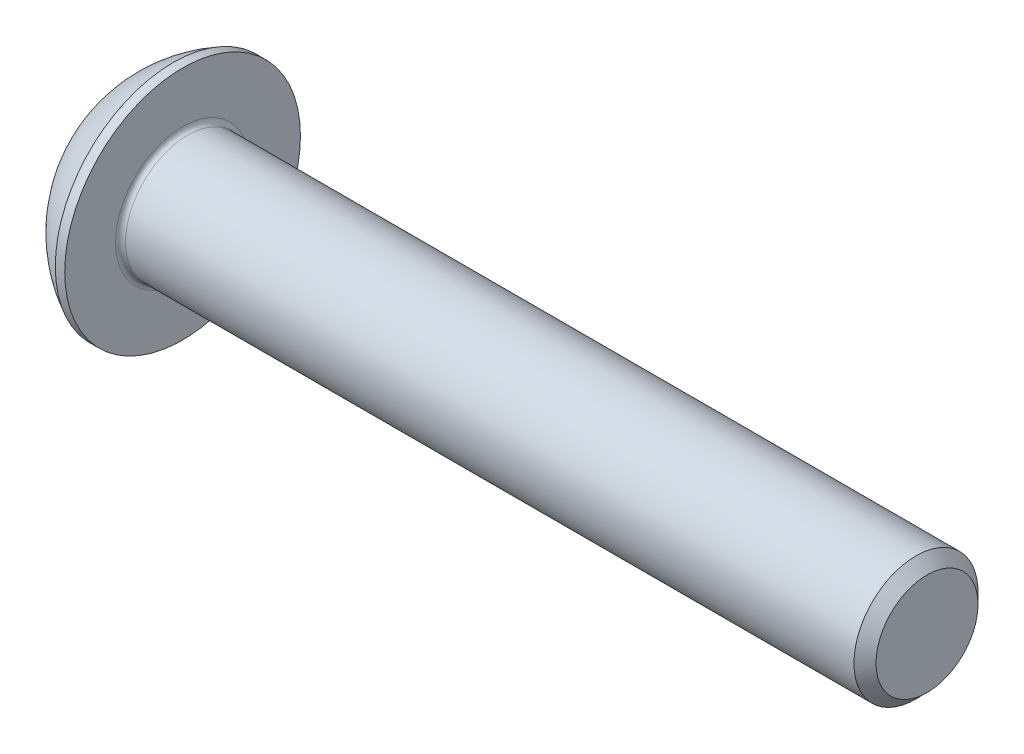
ISO-10303-21;
HEADER;
FILE_DESCRIPTION(('STEP AP214'),'2;1');
FILE_NAME('part.step','',(''),(''),'','','');
FILE_SCHEMA(('AUTOMOTIVE_DESIGN { 1 0 10303 214 1 1 1 1 }'));
ENDSEC;
DATA;
#1=APPLICATION_CONTEXT('core data for automotive mechanical design processes');
#2=APPLICATION_PROTOCOL_DEFINITION('international standard','automotive_design',2000,#1);
#3=PRODUCT_CONTEXT('',#1,'mechanical');
#4=PRODUCT('Part','Part','',(#3));
#5=PRODUCT_RELATED_PRODUCT_CATEGORY('part','',(#4));
#6=PRODUCT_DEFINITION_FORMATION('','',#4);
#7=PRODUCT_DEFINITION_CONTEXT('part definition',#1,'design');
#8=PRODUCT_DEFINITION('design','',#6,#7);
#9=PRODUCT_DEFINITION_SHAPE('','',#8);
#10=(LENGTH_UNIT() NAMED_UNIT(*) SI_UNIT(.MILLI.,.METRE.));
#11=(NAMED_UNIT(*) PLANE_ANGLE_UNIT() SI_UNIT($,.RADIAN.));
#12=(NAMED_UNIT(*) SI_UNIT($,.STERADIAN.) SOLID_ANGLE_UNIT());
#13=UNCERTAINTY_MEASURE_WITH_UNIT(LENGTH_MEASURE(1.E-05),#10,'distance_accuracy_value','');
#14=(GEOMETRIC_REPRESENTATION_CONTEXT(3) GLOBAL_UNCERTAINTY_ASSIGNED_CONTEXT((#13)) GLOBAL_UNIT_ASSIGNED_CONTEXT((#10,
#11,#12)) REPRESENTATION_CONTEXT('',''));
#15=CARTESIAN_POINT('',(0.,0.,0.));
#16=DIRECTION('',(0.,0.,1.));
#17=DIRECTION('',(1.,0.,0.));
#18=AXIS2_PLACEMENT_3D('',#15,#16,#17);
#19=CARTESIAN_POINT('',(0.,0.,0.));
#20=DIRECTION('',(-1.,0.,0.));
#21=DIRECTION('',(0.,0.,1.));
#22=AXIS2_PLACEMENT_3D('',#19,#20,#21);
#23=PLANE('',#22);
#24=CARTESIAN_POINT('',(0.,0.,0.));
#25=DIRECTION('',(-1.,0.,0.));
#26=DIRECTION('',(0.,0.,1.));
#27=AXIS2_PLACEMENT_3D('',#24,#25,#26);
#28=CIRCLE('',#27,2.375);
#29=CARTESIAN_POINT('',(0.,2.375,0.));
#30=VERTEX_POINT('',#29);
#31=EDGE_CURVE('E157',#30,#30,#28,.T.);
#32=ORIENTED_EDGE('',*,*,#31,.T.);
#33=EDGE_LOOP('',(#32));
#34=FACE_BOUND('',#33,.T.);
#35=DIRECTION('',(0.,-1.,0.));
#36=VECTOR('',#35,1.);
#37=CARTESIAN_POINT('',(0.,-0.866025403784438,1.5));
#38=LINE('',#37,#36);
#39=CARTESIAN_POINT('',(0.,0.866025403784439,1.5));
#40=VERTEX_POINT('',#39);
#41=CARTESIAN_POINT('',(0.,-0.866025403784438,1.5));
#42=VERTEX_POINT('',#41);
#43=EDGE_CURVE('E47',#40,#42,#38,.T.);
#44=ORIENTED_EDGE('',*,*,#43,.T.);
#45=DIRECTION('',(0.,-0.5,-0.866025403784439));
#46=VECTOR('',#45,1.);
#47=CARTESIAN_POINT('',(0.,-1.73205080756888,0.));
#48=LINE('',#47,#46);
#49=CARTESIAN_POINT('',(0.,-1.73205080756888,0.));
#50=VERTEX_POINT('',#49);
#51=EDGE_CURVE('E250',#42,#50,#48,.T.);
#52=ORIENTED_EDGE('',*,*,#51,.T.);
#53=DIRECTION('',(0.,0.5,-0.866025403784439));
#54=VECTOR('',#53,1.);
#55=CARTESIAN_POINT('',(0.,-0.866025403784438,-1.5));
#56=LINE('',#55,#54);
#57=CARTESIAN_POINT('',(0.,-0.866025403784438,-1.5));
#58=VERTEX_POINT('',#57);
#59=EDGE_CURVE('E132',#50,#58,#56,.T.);
#60=ORIENTED_EDGE('',*,*,#59,.T.);
#61=DIRECTION('',(0.,1.,0.));
#62=VECTOR('',#61,1.);
#63=CARTESIAN_POINT('',(0.,0.866025403784439,-1.5));
#64=LINE('',#63,#62);
#65=CARTESIAN_POINT('',(0.,0.866025403784439,-1.5));
#66=VERTEX_POINT('',#65);
#67=EDGE_CURVE('E253',#58,#66,#64,.T.);
#68=ORIENTED_EDGE('',*,*,#67,.T.);
#69=DIRECTION('',(0.,0.5,0.866025403784438));
#70=VECTOR('',#69,1.);
#71=CARTESIAN_POINT('',(0.,1.73205080756888,0.));
#72=LINE('',#71,#70);
#73=CARTESIAN_POINT('',(0.,1.73205080756888,0.));
#74=VERTEX_POINT('',#73);
#75=EDGE_CURVE('E255',#66,#74,#72,.T.);
#76=ORIENTED_EDGE('',*,*,#75,.T.);
#77=DIRECTION('',(0.,-0.5,0.866025403784438));
#78=VECTOR('',#77,1.);
#79=CARTESIAN_POINT('',(0.,0.866025403784439,1.5));
#80=LINE('',#79,#78);
#81=EDGE_CURVE('E257',#74,#40,#80,.T.);
#82=ORIENTED_EDGE('',*,*,#81,.T.);
#83=EDGE_LOOP('',(#44,#52,#60,#68,#76,#82));
#84=FACE_BOUND('',#83,.T.);
#85=ADVANCED_FACE('F32',(#34,#84),#23,.T.);
#86=CARTESIAN_POINT('',(4.75501582278481,0.,0.));
#87=DIRECTION('',(-1.,0.,0.));
#88=DIRECTION('',(0.,1.,0.));
#89=AXIS2_PLACEMENT_3D('',#86,#87,#88);
#90=SPHERICAL_SURFACE('',#89,5.3151482081814);
#91=CARTESIAN_POINT('',(2.37,0.,0.));
#92=DIRECTION('',(-1.,0.,0.));
#93=DIRECTION('',(0.,0.,1.));
#94=AXIS2_PLACEMENT_3D('',#91,#92,#93);
#95=CIRCLE('',#94,4.75);
#96=CARTESIAN_POINT('',(2.37,4.75,0.));
#97=VERTEX_POINT('',#96);
#98=EDGE_CURVE('E154',#97,#97,#95,.T.);
#99=CARTESIAN_POINT('',(2.37,4.75,0.));
#100=CARTESIAN_POINT('',(2.33822259048669,4.73404434732511,0.));
#101=CARTESIAN_POINT('',(2.30660534291523,4.71776971995817,0.));
#102=CARTESIAN_POINT('',(2.24370380094997,4.68458927158339,0.));
#103=CARTESIAN_POINT('',(2.21241950655618,4.66768345057555,0.));
#104=CARTESIAN_POINT('',(2.15019650024021,4.6332473706621,0.));
#105=CARTESIAN_POINT('',(2.11925778831804,4.6157171117565,0.));
#106=CARTESIAN_POINT('',(2.05773840110808,4.58003923142985,0.));
#107=CARTESIAN_POINT('',(2.02715772582028,4.56189161000879,0.));
#108=CARTESIAN_POINT('',(1.96636673145741,4.52498631044657,0.));
#109=CARTESIAN_POINT('',(1.93615641238234,4.50622863230542,0.));
#110=CARTESIAN_POINT('',(1.87611829826807,4.46811077571318,0.));
#111=CARTESIAN_POINT('',(1.84629050322887,4.44875059726211,0.));
#112=CARTESIAN_POINT('',(1.78702945162455,4.40943553782984,0.));
#113=CARTESIAN_POINT('',(1.75759619505941,4.38948065684866,0.));
#114=CARTESIAN_POINT('',(1.69913607574061,4.34898423002648,0.));
#115=CARTESIAN_POINT('',(1.67010921298694,4.32844268418549,0.));
#116=CARTESIAN_POINT('',(1.61247357298735,4.28678120152175,0.));
#117=CARTESIAN_POINT('',(1.58386479574143,4.265661264699,0.));
#118=CARTESIAN_POINT('',(1.52707685004032,4.22285150694424,0.));
#119=CARTESIAN_POINT('',(1.49889768158512,4.20116168601223,0.));
#120=CARTESIAN_POINT('',(1.44298030371049,4.15722089644741,0.));
#121=CARTESIAN_POINT('',(1.41524209429107,4.13496992781461,0.));
#122=CARTESIAN_POINT('',(1.36021780711889,4.08991580528235,0.));
#123=CARTESIAN_POINT('',(1.33293172936613,4.06711265138288,0.));
#124=CARTESIAN_POINT('',(1.278822696045,4.02096334316478,0.));
#125=CARTESIAN_POINT('',(1.25199974047662,3.99761718884614,0.));
#126=CARTESIAN_POINT('',(1.19882775550162,3.95039128335163,0.));
#127=CARTESIAN_POINT('',(1.172478726095,3.92651153217576,0.));
#128=CARTESIAN_POINT('',(1.1202652065289,3.87822805145535,0.));
#129=CARTESIAN_POINT('',(1.09440071636942,3.85382432191081,0.));
#130=CARTESIAN_POINT('',(1.04316669321617,3.8045027139941,0.));
#131=CARTESIAN_POINT('',(1.01779716022241,3.77958483562192,0.));
#132=CARTESIAN_POINT('',(0.967563269956099,3.72924496668416,0.));
#133=CARTESIAN_POINT('',(0.942698912683561,3.70382297611859,0.));
#134=CARTESIAN_POINT('',(0.893485388936279,3.65248512247887,0.));
#135=CARTESIAN_POINT('',(0.869136222461535,3.62656925940472,0.));
#136=CARTESIAN_POINT('',(0.820962887873489,3.57425409935884,0.));
#137=CARTESIAN_POINT('',(0.797138719760187,3.54785480238711,0.));
#138=CARTESIAN_POINT('',(0.750024977995377,3.49458340787865,0.));
#139=CARTESIAN_POINT('',(0.726735404343868,3.46771131034191,0.));
#140=CARTESIAN_POINT('',(0.68070023227454,3.41350513847464,0.));
#141=CARTESIAN_POINT('',(0.65795463385672,3.3861710641441,0.));
#142=CARTESIAN_POINT('',(0.613016573919582,3.33105194853939,0.));
#143=CARTESIAN_POINT('',(0.590824112400263,3.30326690726522,0.));
#144=CARTESIAN_POINT('',(0.547001265128254,3.24725704926748,0.));
#145=CARTESIAN_POINT('',(0.525370879375564,3.21903223254391,0.));
#146=CARTESIAN_POINT('',(0.482680896105489,3.16215419227901,0.));
#147=CARTESIAN_POINT('',(0.461621298588104,3.13350096873769,0.));
#148=CARTESIAN_POINT('',(0.420081374357153,3.07577765602272,0.));
#149=CARTESIAN_POINT('',(0.399601047643587,3.04670756684908,0.));
#150=CARTESIAN_POINT('',(0.359227914239947,2.98816223197683,0.));
#151=CARTESIAN_POINT('',(0.339335107549872,2.95868698627821,0.));
#152=CARTESIAN_POINT('',(0.300145026860786,2.89934321060632,0.));
#153=CARTESIAN_POINT('',(0.280847752861776,2.86947468063304,0.));
#154=CARTESIAN_POINT('',(0.24285650999714,2.80935636725696,0.));
#155=CARTESIAN_POINT('',(0.224162541131515,2.77910658385417,0.));
#156=CARTESIAN_POINT('',(0.187385439283607,2.71823794734018,0.));
#157=CARTESIAN_POINT('',(0.169302306301325,2.68761909422898,0.));
#158=CARTESIAN_POINT('',(0.133754156035989,2.626024653246,0.));
#159=CARTESIAN_POINT('',(0.116289138752934,2.59504906537421,0.));
#160=CARTESIAN_POINT('',(0.081984269005742,2.53275362391635,0.));
#161=CARTESIAN_POINT('',(0.0651444165416041,2.50143377033028,0.));
#162=CARTESIAN_POINT('',(0.0320966055444299,2.43846244094735,0.));
#163=CARTESIAN_POINT('',(0.0158886470113937,2.40681096515049,0.));
#164=CARTESIAN_POINT('',(0.,2.375,0.));
#165=B_SPLINE_CURVE_WITH_KNOTS('',3,(#99,#100,#101,#102,#103,#104,#105,#106,#107,#108,#109,#110,
#111,#112,#113,#114,#115,#116,#117,#118,#119,#120,#121,#122,#123,#124,#125,#126,#127,#128,#129,
#130,#131,#132,#133,#134,#135,#136,#137,#138,#139,#140,#141,#142,#143,#144,#145,#146,#147,#148,
#149,#150,#151,#152,#153,#154,#155,#156,#157,#158,#159,#160,#161,#162,#163,#164),.UNSPECIFIED.,
.F.,.F.,(4,2,2,2,2,2,2,2,2,2,2,2,2,2,2,2,2,2,2,2,2,2,2,2,2,2,2,2,2,2,2,2,4),(0.,
0.106672849678272,0.213345699356545,0.320018549034817,0.42669139871309,0.533364248391363,
0.640037098069636,0.746709947747908,0.85338279742618,0.960055647104453,1.06672849678273,
1.173401346461,1.28007419613927,1.38674704581754,1.49341989549582,1.60009274517409,
1.70676559485236,1.81343844453063,1.92011129420891,2.02678414388718,2.13345699356545,
2.24012984324372,2.346802692922,2.45347554260027,2.56014839227854,2.66682124195681,
2.77349409163509,2.88016694131336,2.98683979099163,3.0935126406699,3.20018549034818,
3.30685834002645,3.41353118970472),.UNSPECIFIED.);
#166=EDGE_CURVE('BSEAM178',#97,#30,#165,.T.);
#167=ORIENTED_EDGE('',*,*,#98,.T.);
#168=ORIENTED_EDGE('',*,*,#31,.F.);
#169=ORIENTED_EDGE('',*,*,#166,.T.);
#170=ORIENTED_EDGE('',*,*,#166,.F.);
#171=EDGE_LOOP('',(#167,#169,#168,#170));
#172=FACE_BOUND('',#171,.T.);
#173=ADVANCED_FACE('F178',(#172),#90,.T.);
#174=CARTESIAN_POINT('',(0.,0.,0.));
#175=DIRECTION('',(-1.,0.,0.));
#176=DIRECTION('',(0.,0.,1.));
#177=AXIS2_PLACEMENT_3D('',#174,#175,#176);
#178=CYLINDRICAL_SURFACE('',#177,4.75);
#179=ORIENTED_EDGE('',*,*,#98,.F.);
#180=EDGE_LOOP('',(#179));
#181=FACE_BOUND('',#180,.T.);
#182=CARTESIAN_POINT('',(2.75,0.,0.));
#183=DIRECTION('',(-1.,0.,0.));
#184=DIRECTION('',(0.,0.,1.));
#185=AXIS2_PLACEMENT_3D('',#182,#183,#184);
#186=CIRCLE('',#185,4.75);
#187=CARTESIAN_POINT('',(2.75,0.,4.75));
#188=VERTEX_POINT('',#187);
#189=EDGE_CURVE('E151',#188,#188,#186,.T.);
#190=ORIENTED_EDGE('',*,*,#189,.T.);
#191=EDGE_LOOP('',(#190));
#192=FACE_BOUND('',#191,.T.);
#193=ADVANCED_FACE('F183',(#181,#192),#178,.T.);
#194=CARTESIAN_POINT('',(2.75,2.5,0.));
#195=DIRECTION('',(-1.,0.,0.));
#196=DIRECTION('',(0.,0.,1.));
#197=AXIS2_PLACEMENT_3D('',#194,#195,#196);
#198=PLANE('',#197);
#199=CARTESIAN_POINT('',(2.75,0.,0.));
#200=DIRECTION('',(-1.,0.,0.));
#201=DIRECTION('',(0.,0.,1.));
#202=AXIS2_PLACEMENT_3D('',#199,#200,#201);
#203=CIRCLE('',#202,2.7);
#204=CARTESIAN_POINT('',(2.75,0.,2.7));
#205=VERTEX_POINT('',#204);
#206=EDGE_CURVE('E40',#205,#205,#203,.T.);
#207=ORIENTED_EDGE('',*,*,#206,.T.);
#208=EDGE_LOOP('',(#207));
#209=FACE_BOUND('',#208,.T.);
#210=ORIENTED_EDGE('',*,*,#189,.F.);
#211=EDGE_LOOP('',(#210));
#212=FACE_BOUND('',#211,.T.);
#213=ADVANCED_FACE('F162',(#209,#212),#198,.F.);
#214=CARTESIAN_POINT('',(0.,0.,0.));
#215=DIRECTION('',(-1.,0.,0.));
#216=DIRECTION('',(0.,0.,1.));
#217=AXIS2_PLACEMENT_3D('',#214,#215,#216);
#218=CYLINDRICAL_SURFACE('',#217,2.5);
#219=CARTESIAN_POINT('',(2.95,0.,0.));
#220=DIRECTION('',(-1.,0.,0.));
#221=DIRECTION('',(0.,0.,1.));
#222=AXIS2_PLACEMENT_3D('',#219,#220,#221);
#223=CIRCLE('',#222,2.5);
#224=CARTESIAN_POINT('',(2.95,0.,2.5));
#225=VERTEX_POINT('',#224);
#226=EDGE_CURVE('E11',#225,#225,#223,.F.);
#227=ORIENTED_EDGE('',*,*,#226,.T.);
#228=EDGE_LOOP('',(#227));
#229=FACE_BOUND('',#228,.T.);
#230=CARTESIAN_POINT('',(32.305,0.,0.));
#231=DIRECTION('',(-1.,0.,0.));
#232=DIRECTION('',(0.,0.,1.));
#233=AXIS2_PLACEMENT_3D('',#230,#231,#232);
#234=CIRCLE('',#233,2.5);
#235=CARTESIAN_POINT('',(32.305,0.,2.5));
#236=VERTEX_POINT('',#235);
#237=EDGE_CURVE('E148',#236,#236,#234,.T.);
#238=ORIENTED_EDGE('',*,*,#237,.T.);
#239=EDGE_LOOP('',(#238));
#240=FACE_BOUND('',#239,.T.);
#241=ADVANCED_FACE('F192',(#229,#240),#218,.T.);
#242=CARTESIAN_POINT('',(32.75,0.,0.));
#243=DIRECTION('',(-1.,0.,0.));
#244=DIRECTION('',(0.,0.,1.));
#245=AXIS2_PLACEMENT_3D('',#242,#243,#244);
#246=CONICAL_SURFACE('',#245,2.055,0.785398163397428);
#247=ORIENTED_EDGE('',*,*,#237,.F.);
#248=EDGE_LOOP('',(#247));
#249=FACE_BOUND('',#248,.T.);
#250=CARTESIAN_POINT('',(32.75,0.,0.));
#251=DIRECTION('',(-1.,0.,0.));
#252=DIRECTION('',(0.,0.,1.));
#253=AXIS2_PLACEMENT_3D('',#250,#251,#252);
#254=CIRCLE('',#253,2.055);
#255=CARTESIAN_POINT('',(32.75,0.,2.055));
#256=VERTEX_POINT('',#255);
#257=EDGE_CURVE('E144',#256,#256,#254,.T.);
#258=ORIENTED_EDGE('',*,*,#257,.T.);
#259=EDGE_LOOP('',(#258));
#260=FACE_BOUND('',#259,.T.);
#261=ADVANCED_FACE('F173',(#249,#260),#246,.T.);
#262=CARTESIAN_POINT('',(32.75,0.,0.));
#263=DIRECTION('',(-1.,0.,0.));
#264=DIRECTION('',(0.,0.,1.));
#265=AXIS2_PLACEMENT_3D('',#262,#263,#264);
#266=PLANE('',#265);
#267=ORIENTED_EDGE('',*,*,#257,.F.);
#268=EDGE_LOOP('',(#267));
#269=FACE_BOUND('',#268,.T.);
#270=ADVANCED_FACE('F166',(#269),#266,.F.);
#271=CARTESIAN_POINT('',(2.95,0.,0.));
#272=DIRECTION('',(-1.,0.,0.));
#273=DIRECTION('',(0.,0.,1.));
#274=AXIS2_PLACEMENT_3D('',#271,#272,#273);
#275=TOROIDAL_SURFACE('',#274,2.7,0.2);
#276=ORIENTED_EDGE('',*,*,#226,.F.);
#277=EDGE_LOOP('',(#276));
#278=FACE_BOUND('',#277,.T.);
#279=ORIENTED_EDGE('',*,*,#206,.F.);
#280=EDGE_LOOP('',(#279));
#281=FACE_BOUND('',#280,.T.);
#282=ADVANCED_FACE('F34',(#278,#281),#275,.F.);
#283=CARTESIAN_POINT('',(1.56,-1.73205080756888,0.));
#284=DIRECTION('',(0.,0.866025403784438,-0.5));
#285=DIRECTION('',(0.,0.5,0.866025403784439));
#286=AXIS2_PLACEMENT_3D('',#283,#284,#285);
#287=PLANE('',#286);
#288=DIRECTION('',(0.,-0.5,-0.866025403784439));
#289=VECTOR('',#288,1.);
#290=CARTESIAN_POINT('',(1.56,-1.73205080756888,0.));
#291=LINE('',#290,#289);
#292=CARTESIAN_POINT('',(1.56,-0.866025403784438,1.5));
#293=VERTEX_POINT('',#292);
#294=CARTESIAN_POINT('',(1.56,-1.29903810567666,0.75));
#295=VERTEX_POINT('',#294);
#296=EDGE_CURVE('E115',#293,#295,#291,.T.);
#297=ORIENTED_EDGE('',*,*,#296,.T.);
#298=CARTESIAN_POINT('',(1.56,-1.73205080756888,0.));
#299=VERTEX_POINT('',#298);
#300=EDGE_CURVE('E108',#295,#299,#291,.T.);
#301=ORIENTED_EDGE('',*,*,#300,.T.);
#302=DIRECTION('',(-1.,0.,0.));
#303=VECTOR('',#302,1.);
#304=CARTESIAN_POINT('',(1.56,-1.73205080756888,0.));
#305=LINE('',#304,#303);
#306=EDGE_CURVE('E112',#299,#50,#305,.T.);
#307=ORIENTED_EDGE('',*,*,#306,.T.);
#308=ORIENTED_EDGE('',*,*,#51,.F.);
#309=DIRECTION('',(-1.,0.,0.));
#310=VECTOR('',#309,1.);
#311=CARTESIAN_POINT('',(1.56,-0.866025403784438,1.5));
#312=LINE('',#311,#310);
#313=EDGE_CURVE('E240',#293,#42,#312,.T.);
#314=ORIENTED_EDGE('',*,*,#313,.F.);
#315=EDGE_LOOP('',(#297,#301,#307,#308,#314));
#316=FACE_BOUND('',#315,.T.);
#317=ADVANCED_FACE('F110',(#316),#287,.T.);
#318=CARTESIAN_POINT('',(1.56,-0.866025403784438,-1.5));
#319=DIRECTION('',(0.,0.866025403784438,0.5));
#320=DIRECTION('',(0.,-0.5,0.866025403784439));
#321=AXIS2_PLACEMENT_3D('',#318,#319,#320);
#322=PLANE('',#321);
#323=DIRECTION('',(0.,0.5,-0.866025403784439));
#324=VECTOR('',#323,1.);
#325=CARTESIAN_POINT('',(1.56,-0.866025403784438,-1.5));
#326=LINE('',#325,#324);
#327=CARTESIAN_POINT('',(1.56,-1.29903810567666,-0.75));
#328=VERTEX_POINT('',#327);
#329=EDGE_CURVE('E120',#299,#328,#326,.T.);
#330=ORIENTED_EDGE('',*,*,#329,.T.);
#331=CARTESIAN_POINT('',(1.56,-0.866025403784438,-1.5));
#332=VERTEX_POINT('',#331);
#333=EDGE_CURVE('E127',#328,#332,#326,.T.);
#334=ORIENTED_EDGE('',*,*,#333,.T.);
#335=DIRECTION('',(-1.,0.,0.));
#336=VECTOR('',#335,1.);
#337=CARTESIAN_POINT('',(1.56,-0.866025403784438,-1.5));
#338=LINE('',#337,#336);
#339=EDGE_CURVE('E134',#332,#58,#338,.T.);
#340=ORIENTED_EDGE('',*,*,#339,.T.);
#341=ORIENTED_EDGE('',*,*,#59,.F.);
#342=ORIENTED_EDGE('',*,*,#306,.F.);
#343=EDGE_LOOP('',(#330,#334,#340,#341,#342));
#344=FACE_BOUND('',#343,.T.);
#345=ADVANCED_FACE('F130',(#344),#322,.T.);
#346=CARTESIAN_POINT('',(1.56,0.866025403784439,-1.5));
#347=DIRECTION('',(0.,0.,1.));
#348=DIRECTION('',(1.,0.,0.));
#349=AXIS2_PLACEMENT_3D('',#346,#347,#348);
#350=PLANE('',#349);
#351=DIRECTION('',(0.,1.,0.));
#352=VECTOR('',#351,1.);
#353=CARTESIAN_POINT('',(1.56,0.866025403784439,-1.5));
#354=LINE('',#353,#352);
#355=CARTESIAN_POINT('',(1.56,0.,-1.5));
#356=VERTEX_POINT('',#355);
#357=EDGE_CURVE('E276',#332,#356,#354,.T.);
#358=ORIENTED_EDGE('',*,*,#357,.T.);
#359=CARTESIAN_POINT('',(1.56,0.866025403784439,-1.5));
#360=VERTEX_POINT('',#359);
#361=EDGE_CURVE('E126',#356,#360,#354,.T.);
#362=ORIENTED_EDGE('',*,*,#361,.T.);
#363=DIRECTION('',(-1.,0.,0.));
#364=VECTOR('',#363,1.);
#365=CARTESIAN_POINT('',(1.56,0.866025403784439,-1.5));
#366=LINE('',#365,#364);
#367=EDGE_CURVE('E139',#360,#66,#366,.T.);
#368=ORIENTED_EDGE('',*,*,#367,.T.);
#369=ORIENTED_EDGE('',*,*,#67,.F.);
#370=ORIENTED_EDGE('',*,*,#339,.F.);
#371=EDGE_LOOP('',(#358,#362,#368,#369,#370));
#372=FACE_BOUND('',#371,.T.);
#373=ADVANCED_FACE('F206',(#372),#350,.T.);
#374=CARTESIAN_POINT('',(1.56,1.73205080756888,0.));
#375=DIRECTION('',(0.,-0.866025403784438,0.5));
#376=DIRECTION('',(0.,-0.5,-0.866025403784439));
#377=AXIS2_PLACEMENT_3D('',#374,#375,#376);
#378=PLANE('',#377);
#379=DIRECTION('',(0.,0.5,0.866025403784438));
#380=VECTOR('',#379,1.);
#381=CARTESIAN_POINT('',(1.56,1.73205080756888,0.));
#382=LINE('',#381,#380);
#383=CARTESIAN_POINT('',(1.56,1.29903810567666,-0.750000000000001));
#384=VERTEX_POINT('',#383);
#385=EDGE_CURVE('E282',#360,#384,#382,.T.);
#386=ORIENTED_EDGE('',*,*,#385,.T.);
#387=CARTESIAN_POINT('',(1.56,1.73205080756888,0.));
#388=VERTEX_POINT('',#387);
#389=EDGE_CURVE('E280',#384,#388,#382,.T.);
#390=ORIENTED_EDGE('',*,*,#389,.T.);
#391=DIRECTION('',(-1.,0.,0.));
#392=VECTOR('',#391,1.);
#393=CARTESIAN_POINT('',(1.56,1.73205080756888,0.));
#394=LINE('',#393,#392);
#395=EDGE_CURVE('E262',#388,#74,#394,.T.);
#396=ORIENTED_EDGE('',*,*,#395,.T.);
#397=ORIENTED_EDGE('',*,*,#75,.F.);
#398=ORIENTED_EDGE('',*,*,#367,.F.);
#399=EDGE_LOOP('',(#386,#390,#396,#397,#398));
#400=FACE_BOUND('',#399,.T.);
#401=ADVANCED_FACE('F209',(#400),#378,.T.);
#402=CARTESIAN_POINT('',(1.56,0.866025403784439,1.5));
#403=DIRECTION('',(0.,-0.866025403784438,-0.5));
#404=DIRECTION('',(0.,0.5,-0.866025403784439));
#405=AXIS2_PLACEMENT_3D('',#402,#403,#404);
#406=PLANE('',#405);
#407=DIRECTION('',(0.,-0.5,0.866025403784438));
#408=VECTOR('',#407,1.);
#409=CARTESIAN_POINT('',(1.56,0.866025403784439,1.5));
#410=LINE('',#409,#408);
#411=CARTESIAN_POINT('',(1.56,1.29903810567666,0.750000000000001));
#412=VERTEX_POINT('',#411);
#413=EDGE_CURVE('E246',#388,#412,#410,.T.);
#414=ORIENTED_EDGE('',*,*,#413,.T.);
#415=CARTESIAN_POINT('',(1.56,0.866025403784439,1.5));
#416=VERTEX_POINT('',#415);
#417=EDGE_CURVE('E238',#412,#416,#410,.T.);
#418=ORIENTED_EDGE('',*,*,#417,.T.);
#419=DIRECTION('',(-1.,0.,0.));
#420=VECTOR('',#419,1.);
#421=CARTESIAN_POINT('',(1.56,0.866025403784439,1.5));
#422=LINE('',#421,#420);
#423=EDGE_CURVE('E244',#416,#40,#422,.T.);
#424=ORIENTED_EDGE('',*,*,#423,.T.);
#425=ORIENTED_EDGE('',*,*,#81,.F.);
#426=ORIENTED_EDGE('',*,*,#395,.F.);
#427=EDGE_LOOP('',(#414,#418,#424,#425,#426));
#428=FACE_BOUND('',#427,.T.);
#429=ADVANCED_FACE('F213',(#428),#406,.T.);
#430=CARTESIAN_POINT('',(1.56,-0.866025403784438,1.5));
#431=DIRECTION('',(0.,0.,-1.));
#432=DIRECTION('',(-1.,0.,0.));
#433=AXIS2_PLACEMENT_3D('',#430,#431,#432);
#434=PLANE('',#433);
#435=DIRECTION('',(0.,-1.,0.));
#436=VECTOR('',#435,1.);
#437=CARTESIAN_POINT('',(1.56,-0.866025403784438,1.5));
#438=LINE('',#437,#436);
#439=CARTESIAN_POINT('',(1.56,0.,1.5));
#440=VERTEX_POINT('',#439);
#441=EDGE_CURVE('E55',#416,#440,#438,.T.);
#442=ORIENTED_EDGE('',*,*,#441,.T.);
#443=EDGE_CURVE('E241',#440,#293,#438,.T.);
#444=ORIENTED_EDGE('',*,*,#443,.T.);
#445=ORIENTED_EDGE('',*,*,#313,.T.);
#446=ORIENTED_EDGE('',*,*,#43,.F.);
#447=ORIENTED_EDGE('',*,*,#423,.F.);
#448=EDGE_LOOP('',(#442,#444,#445,#446,#447));
#449=FACE_BOUND('',#448,.T.);
#450=ADVANCED_FACE('F217',(#449),#434,.T.);
#451=CARTESIAN_POINT('',(1.56,0.,3.));
#452=DIRECTION('',(-1.,0.,0.));
#453=DIRECTION('',(0.,0.,1.));
#454=AXIS2_PLACEMENT_3D('',#451,#452,#453);
#455=PLANE('',#454);
#456=ORIENTED_EDGE('',*,*,#441,.F.);
#457=ORIENTED_EDGE('',*,*,#417,.F.);
#458=CARTESIAN_POINT('',(1.56,0.,0.));
#459=DIRECTION('',(-1.,0.,0.));
#460=DIRECTION('',(0.,0.,1.));
#461=AXIS2_PLACEMENT_3D('',#458,#459,#460);
#462=CIRCLE('',#461,1.5);
#463=EDGE_CURVE('E138',#440,#412,#462,.T.);
#464=ORIENTED_EDGE('',*,*,#463,.F.);
#465=EDGE_LOOP('',(#456,#457,#464));
#466=FACE_BOUND('',#465,.T.);
#467=ADVANCED_FACE('F221',(#466),#455,.T.);
#468=ORIENTED_EDGE('',*,*,#413,.F.);
#469=ORIENTED_EDGE('',*,*,#389,.F.);
#470=EDGE_CURVE('E145',#412,#384,#462,.T.);
#471=ORIENTED_EDGE('',*,*,#470,.F.);
#472=EDGE_LOOP('',(#468,#469,#471));
#473=FACE_BOUND('',#472,.T.);
#474=ADVANCED_FACE('F229',(#473),#455,.T.);
#475=ORIENTED_EDGE('',*,*,#385,.F.);
#476=ORIENTED_EDGE('',*,*,#361,.F.);
#477=EDGE_CURVE('E287',#384,#356,#462,.T.);
#478=ORIENTED_EDGE('',*,*,#477,.F.);
#479=EDGE_LOOP('',(#475,#476,#478));
#480=FACE_BOUND('',#479,.T.);
#481=ADVANCED_FACE('F234',(#480),#455,.T.);
#482=ORIENTED_EDGE('',*,*,#357,.F.);
#483=ORIENTED_EDGE('',*,*,#333,.F.);
#484=EDGE_CURVE('E279',#356,#328,#462,.T.);
#485=ORIENTED_EDGE('',*,*,#484,.F.);
#486=EDGE_LOOP('',(#482,#483,#485));
#487=FACE_BOUND('',#486,.T.);
#488=ADVANCED_FACE('F227',(#487),#455,.T.);
#489=ORIENTED_EDGE('',*,*,#329,.F.);
#490=ORIENTED_EDGE('',*,*,#300,.F.);
#491=EDGE_CURVE('E122',#328,#295,#462,.T.);
#492=ORIENTED_EDGE('',*,*,#491,.F.);
#493=EDGE_LOOP('',(#489,#490,#492));
#494=FACE_BOUND('',#493,.T.);
#495=ADVANCED_FACE('F121',(#494),#455,.T.);
#496=ORIENTED_EDGE('',*,*,#296,.F.);
#497=ORIENTED_EDGE('',*,*,#443,.F.);
#498=EDGE_CURVE('E133',#295,#440,#462,.T.);
#499=ORIENTED_EDGE('',*,*,#498,.F.);
#500=EDGE_LOOP('',(#496,#497,#499));
#501=FACE_BOUND('',#500,.T.);
#502=ADVANCED_FACE('F201',(#501),#455,.T.);
#503=CARTESIAN_POINT('',(2.42602540378445,0.,0.));
#504=DIRECTION('',(-1.,0.,0.));
#505=DIRECTION('',(0.,0.,1.));
#506=AXIS2_PLACEMENT_3D('',#503,#504,#505);
#507=CONICAL_SURFACE('',#506,0.,1.04719755119659);
#508=ORIENTED_EDGE('',*,*,#463,.T.);
#509=ORIENTED_EDGE('',*,*,#470,.T.);
#510=ORIENTED_EDGE('',*,*,#477,.T.);
#511=ORIENTED_EDGE('',*,*,#484,.T.);
#512=ORIENTED_EDGE('',*,*,#491,.T.);
#513=ORIENTED_EDGE('',*,*,#498,.T.);
#514=EDGE_LOOP('',(#508,#509,#510,#511,#512,#513));
#515=FACE_BOUND('',#514,.T.);
#516=CARTESIAN_POINT('',(2.42602540378445,0.,0.));
#517=VERTEX_POINT('',#516);
#518=VERTEX_LOOP('',#517);
#519=FACE_BOUND('',#518,.T.);
#520=ADVANCED_FACE('F199',(#515,#519),#507,.F.);
#521=CLOSED_SHELL('',(#85,#173,#193,#213,#241,#261,#270,#282,#317,#345,#373,#401,#429,#450,#467,
#474,#481,#488,#495,#502,#520));
#522=MANIFOLD_SOLID_BREP('B2',#521);
#523=ADVANCED_BREP_SHAPE_REPRESENTATION('',(#18,#522),#14);
#524=SHAPE_DEFINITION_REPRESENTATION(#9,#523);
ENDSEC;
END-ISO-10303-21;
